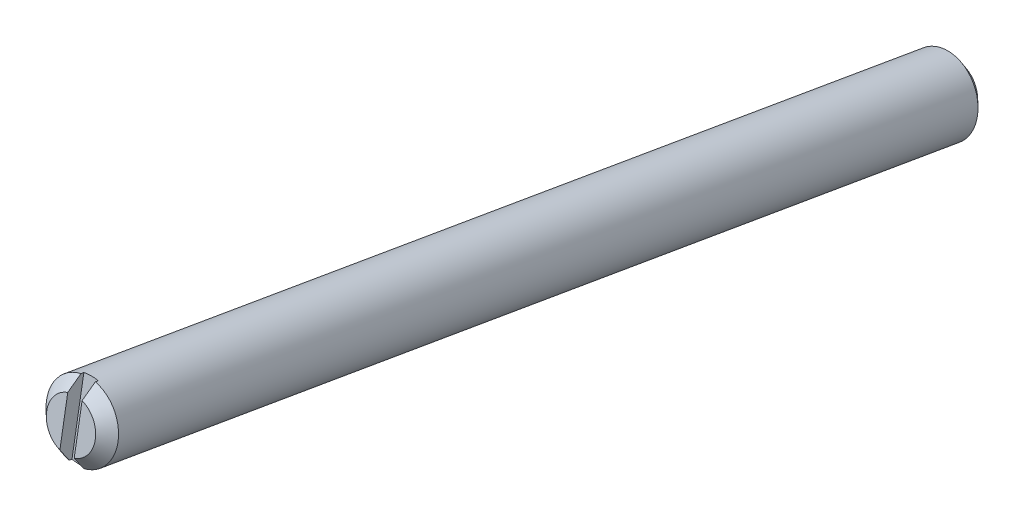
ISO-10303-21;
HEADER;
FILE_DESCRIPTION(('STEP AP214'),'2;1');
FILE_NAME('part.step','',(''),(''),'','','');
FILE_SCHEMA(('AUTOMOTIVE_DESIGN { 1 0 10303 214 1 1 1 1 }'));
ENDSEC;
DATA;
#1=APPLICATION_CONTEXT('core data for automotive mechanical design processes');
#2=APPLICATION_PROTOCOL_DEFINITION('international standard','automotive_design',2000,#1);
#3=PRODUCT_CONTEXT('',#1,'mechanical');
#4=PRODUCT('Part','Part','',(#3));
#5=PRODUCT_RELATED_PRODUCT_CATEGORY('part','',(#4));
#6=PRODUCT_DEFINITION_FORMATION('','',#4);
#7=PRODUCT_DEFINITION_CONTEXT('part definition',#1,'design');
#8=PRODUCT_DEFINITION('design','',#6,#7);
#9=PRODUCT_DEFINITION_SHAPE('','',#8);
#10=(LENGTH_UNIT() NAMED_UNIT(*) SI_UNIT(.MILLI.,.METRE.));
#11=(NAMED_UNIT(*) PLANE_ANGLE_UNIT() SI_UNIT($,.RADIAN.));
#12=(NAMED_UNIT(*) SI_UNIT($,.STERADIAN.) SOLID_ANGLE_UNIT());
#13=UNCERTAINTY_MEASURE_WITH_UNIT(LENGTH_MEASURE(1.E-05),#10,'distance_accuracy_value','');
#14=(GEOMETRIC_REPRESENTATION_CONTEXT(3) GLOBAL_UNCERTAINTY_ASSIGNED_CONTEXT((#13)) GLOBAL_UNIT_ASSIGNED_CONTEXT((#10,
#11,#12)) REPRESENTATION_CONTEXT('',''));
#15=CARTESIAN_POINT('',(0.,0.,0.));
#16=DIRECTION('',(0.,0.,1.));
#17=DIRECTION('',(1.,0.,0.));
#18=AXIS2_PLACEMENT_3D('',#15,#16,#17);
#19=CARTESIAN_POINT('',(18.5,24.9286163690419,-14.3895334289005));
#20=DIRECTION('',(0.,0.168953334472427,0.985624051436778));
#21=DIRECTION('',(-1.,0.,0.));
#22=AXIS2_PLACEMENT_3D('',#19,#20,#21);
#23=CONICAL_SURFACE('',#22,4.2,0.78539816339745);
#24=CARTESIAN_POINT('',(18.5,24.793453701464,-15.17803267005));
#25=DIRECTION('',(0.,0.168953334472427,0.985624051436778));
#26=DIRECTION('',(-1.,0.,0.));
#27=AXIS2_PLACEMENT_3D('',#24,#25,#26);
#28=CIRCLE('',#27,3.4);
#29=CARTESIAN_POINT('',(15.1,24.793453701464,-15.17803267005));
#30=VERTEX_POINT('',#29);
#31=EDGE_CURVE('E11',#30,#30,#28,.T.);
#32=ORIENTED_EDGE('',*,*,#31,.T.);
#33=EDGE_LOOP('',(#32));
#34=FACE_BOUND('',#33,.T.);
#35=CARTESIAN_POINT('',(18.5,25.0637790366199,-13.6010341877511));
#36=DIRECTION('',(0.,0.168953334472427,0.985624051436778));
#37=DIRECTION('',(-1.,0.,0.));
#38=AXIS2_PLACEMENT_3D('',#35,#36,#37);
#39=CIRCLE('',#38,5.);
#40=CARTESIAN_POINT('',(13.5,25.0637790366199,-13.6010341877511));
#41=VERTEX_POINT('',#40);
#42=EDGE_CURVE('E134',#41,#41,#39,.T.);
#43=ORIENTED_EDGE('',*,*,#42,.F.);
#44=EDGE_LOOP('',(#43));
#45=FACE_BOUND('',#44,.T.);
#46=ADVANCED_FACE('F17',(#34,#45),#23,.T.);
#47=CARTESIAN_POINT('',(18.5,45.7774578429394,107.236474518398));
#48=DIRECTION('',(0.,-0.168953334472427,-0.985624051436778));
#49=DIRECTION('',(-0.979795897113271,-0.197124810287356,0.0337906668944858));
#50=AXIS2_PLACEMENT_3D('',#47,#48,#49);
#51=CONICAL_SURFACE('',#50,4.2,0.78539816339745);
#52=CARTESIAN_POINT('',(18.5,45.6422951753614,106.447975277248));
#53=DIRECTION('',(0.,0.168953334472427,0.985624051436778));
#54=DIRECTION('',(-0.2,0.965710401693915,-0.16553978391969));
#55=AXIS2_PLACEMENT_3D('',#52,#53,#54);
#56=CIRCLE('',#55,5.);
#57=CARTESIAN_POINT('',(17.5,50.470847183831,105.62027635765));
#58=VERTEX_POINT('',#57);
#59=CARTESIAN_POINT('',(13.5,45.6422951753614,106.447975277248));
#60=VERTEX_POINT('',#59);
#61=EDGE_CURVE('E153',#58,#60,#56,.T.);
#62=ORIENTED_EDGE('',*,*,#61,.T.);
#63=CARTESIAN_POINT('',(18.5,45.6422951753614,106.447975277248));
#64=DIRECTION('',(0.,0.168953334472427,0.985624051436778));
#65=DIRECTION('',(-1.,0.,0.));
#66=AXIS2_PLACEMENT_3D('',#63,#64,#65);
#67=CIRCLE('',#66,5.);
#68=CARTESIAN_POINT('',(17.5,40.8137431668919,107.275674196847));
#69=VERTEX_POINT('',#68);
#70=EDGE_CURVE('E150',#60,#69,#67,.T.);
#71=ORIENTED_EDGE('',*,*,#70,.T.);
#72=CARTESIAN_POINT('',(17.5,40.8137431668919,107.275674196847));
#73=CARTESIAN_POINT('',(17.5,40.9173075964634,107.347353775387));
#74=CARTESIAN_POINT('',(17.5,41.0277724140901,107.423721007748));
#75=CARTESIAN_POINT('',(17.5,41.2355486457281,107.567148543276));
#76=CARTESIAN_POINT('',(17.5,41.4429496571701,107.710115308227));
#77=CARTESIAN_POINT('',(17.5,41.6451001573134,107.849017023928));
#78=CARTESIAN_POINT('',(17.5,41.8556720049782,107.993413851894));
#79=CARTESIAN_POINT('',(17.5,42.0261269469763,108.11005994117));
#80=CARTESIAN_POINT('',(17.5,42.2385203226982,108.254825106778));
#81=CARTESIAN_POINT('',(17.5,42.4171900261511,108.3762551526));
#82=CARTESIAN_POINT('',(17.5,42.5675274270475,108.478082747319));
#83=CARTESIAN_POINT('',(17.5,42.6747684807775,108.550450791225));
#84=CARTESIAN_POINT('',(17.5,42.7097214519552,108.574007110685));
#85=(BOUNDED_CURVE() B_SPLINE_CURVE(3,(#72,#73,#74,#75,#76,#77,#78,#79,#80,#81,#82,#83,#84),
.UNSPECIFIED.,.F.,.F.) B_SPLINE_CURVE_WITH_KNOTS((4,1,1,1,1,1,1,1,1,1,4),(0.,0.164432285209661,
0.175322036538691,0.329608986927773,0.493296007394346,0.495530634029008,0.662942303700203,
0.762946894621977,0.831098980296955,0.944972635631533,1.),
.UNSPECIFIED.) CURVE() GEOMETRIC_REPRESENTATION_ITEM() RATIONAL_B_SPLINE_CURVE((1.,1.,1.,1.,1.,
1.,1.,1.,1.,1.,1.,1.,1.)) REPRESENTATION_ITEM(''));
#86=CARTESIAN_POINT('',(17.5,42.7097214519552,108.574007110685));
#87=VERTEX_POINT('',#86);
#88=EDGE_CURVE('E26',#69,#87,#85,.T.);
#89=ORIENTED_EDGE('',*,*,#88,.T.);
#90=CARTESIAN_POINT('',(18.5,45.9126205105173,108.024973759547));
#91=DIRECTION('',(0.,0.168953334472426,0.985624051436778));
#92=DIRECTION('',(-0.294117646904669,0.942029134917965,-0.161480397401579));
#93=AXIS2_PLACEMENT_3D('',#90,#91,#92);
#94=CIRCLE('',#93,3.4);
#95=CARTESIAN_POINT('',(17.5000000001743,49.1155195700125,107.475940407934));
#96=VERTEX_POINT('',#95);
#97=EDGE_CURVE('E185',#96,#87,#94,.T.);
#98=ORIENTED_EDGE('',*,*,#97,.F.);
#99=CARTESIAN_POINT('',(17.4999999999988,49.1155195698818,107.475940407327));
#100=CARTESIAN_POINT('',(17.4999999999994,49.1406316525485,107.442087879121));
#101=CARTESIAN_POINT('',(17.5000000000006,49.2176481649491,107.338134840865));
#102=CARTESIAN_POINT('',(17.5,49.3254891619477,107.192050918553));
#103=CARTESIAN_POINT('',(17.5,49.4535163820363,107.018047614404));
#104=CARTESIAN_POINT('',(17.5,49.605570237469,106.810809769992));
#105=CARTESIAN_POINT('',(17.5,49.7274449722873,106.644053221671));
#106=CARTESIAN_POINT('',(17.5,49.8779039660401,106.437769344263));
#107=CARTESIAN_POINT('',(17.5,50.0222525322234,106.23947158145));
#108=CARTESIAN_POINT('',(17.5,50.1701979953074,106.035592167627));
#109=CARTESIAN_POINT('',(17.5,50.3183437979276,105.831153322163));
#110=CARTESIAN_POINT('',(17.5,50.39706810268,105.722355739686));
#111=CARTESIAN_POINT('',(17.5,50.470847183831,105.62027635765));
#112=(BOUNDED_CURVE() B_SPLINE_CURVE(3,(#99,#100,#101,#102,#103,#104,#105,#106,#107,#108,#109,
#110,#111),.UNSPECIFIED.,.F.,.F.) B_SPLINE_CURVE_WITH_KNOTS((4,1,1,1,1,1,1,1,1,1,4),(-1.,
-0.944972635892414,-0.831098980393359,-0.762946895069346,-0.662942303860907,-0.495530634221856,
-0.493296007683616,-0.329608987088477,-0.175322036641499,-0.16443228530608,0.),
.UNSPECIFIED.) CURVE() GEOMETRIC_REPRESENTATION_ITEM() RATIONAL_B_SPLINE_CURVE((1.,1.,1.,1.,1.,
1.,1.,1.,1.,1.,1.,1.,1.)) REPRESENTATION_ITEM(''));
#113=EDGE_CURVE('E117',#96,#58,#112,.T.);
#114=ORIENTED_EDGE('',*,*,#113,.T.);
#115=EDGE_LOOP('',(#62,#71,#89,#98,#114));
#116=FACE_BOUND('',#115,.T.);
#117=ADVANCED_FACE('F19',(#116),#51,.T.);
#118=CARTESIAN_POINT('',(18.5,45.7774578429394,107.236474518398));
#119=DIRECTION('',(0.,-0.168953334472427,-0.985624051436778));
#120=DIRECTION('',(0.979795897113271,0.197124810287356,-0.0337906668944858));
#121=AXIS2_PLACEMENT_3D('',#118,#119,#120);
#122=CONICAL_SURFACE('',#121,4.2,0.78539816339745);
#123=CARTESIAN_POINT('',(18.5,45.6422951753614,106.447975277248));
#124=DIRECTION('',(0.,0.168953334472427,0.985624051436778));
#125=DIRECTION('',(0.2,-0.965710401693915,0.16553978391969));
#126=AXIS2_PLACEMENT_3D('',#123,#124,#125);
#127=CIRCLE('',#126,5.);
#128=CARTESIAN_POINT('',(19.5,40.8137431668919,107.275674196847));
#129=VERTEX_POINT('',#128);
#130=CARTESIAN_POINT('',(19.5,50.470847183831,105.62027635765));
#131=VERTEX_POINT('',#130);
#132=EDGE_CURVE('E125',#129,#131,#127,.T.);
#133=ORIENTED_EDGE('',*,*,#132,.T.);
#134=CARTESIAN_POINT('',(19.5,50.470847183831,105.62027635765));
#135=CARTESIAN_POINT('',(19.5,50.3970681026799,105.722355739685));
#136=CARTESIAN_POINT('',(19.5,50.3183437979275,105.831153322163));
#137=CARTESIAN_POINT('',(19.5,50.1701979952928,106.035592167647));
#138=CARTESIAN_POINT('',(19.5,50.0222525322083,106.23947158147));
#139=CARTESIAN_POINT('',(19.5,49.8779039659818,106.437769344344));
#140=CARTESIAN_POINT('',(19.5,49.7274449721397,106.644053221872));
#141=CARTESIAN_POINT('',(19.5,49.6055702373217,106.810809770193));
#142=CARTESIAN_POINT('',(19.5,49.4535163817556,107.018047614786));
#143=CARTESIAN_POINT('',(19.5,49.325489161637,107.192050918975));
#144=CARTESIAN_POINT('',(19.5,49.2176481643705,107.338134841647));
#145=CARTESIAN_POINT('',(19.5,49.1406316518802,107.442087880024));
#146=CARTESIAN_POINT('',(19.5,49.1155195690794,107.475940408409));
#147=(BOUNDED_CURVE() B_SPLINE_CURVE(3,(#134,#135,#136,#137,#138,#139,#140,#141,#142,#143,#144,
#145,#146),.UNSPECIFIED.,.F.,.F.) B_SPLINE_CURVE_WITH_KNOTS((4,1,1,1,1,1,1,1,1,1,4),(0.,
0.164432285209656,0.175322036538704,0.329608986927784,0.49329600739437,0.495530634029014,
0.662942303700213,0.762946894622001,0.831098980296964,0.944972635631551,1.),
.UNSPECIFIED.) CURVE() GEOMETRIC_REPRESENTATION_ITEM() RATIONAL_B_SPLINE_CURVE((1.,1.,1.,1.,1.,
1.,1.,1.,1.,1.,1.,1.,1.)) REPRESENTATION_ITEM(''));
#148=CARTESIAN_POINT('',(19.5,49.1155195690794,107.475940408409));
#149=VERTEX_POINT('',#148);
#150=EDGE_CURVE('E105',#131,#149,#147,.T.);
#151=ORIENTED_EDGE('',*,*,#150,.T.);
#152=CARTESIAN_POINT('',(18.5,45.9126205105173,108.024973759547));
#153=DIRECTION('',(0.,0.168953334472426,0.985624051436778));
#154=DIRECTION('',(0.29411764690467,-0.942029134917964,0.161480397401579));
#155=AXIS2_PLACEMENT_3D('',#152,#153,#154);
#156=CIRCLE('',#155,3.4);
#157=CARTESIAN_POINT('',(19.4999999998257,42.7097214509173,108.574007110548));
#158=VERTEX_POINT('',#157);
#159=EDGE_CURVE('E193',#158,#149,#156,.T.);
#160=ORIENTED_EDGE('',*,*,#159,.F.);
#161=CARTESIAN_POINT('',(19.5000000000012,42.7097214508381,108.574007109932));
#162=CARTESIAN_POINT('',(19.5000000000006,42.6747684798468,108.550450790597));
#163=CARTESIAN_POINT('',(19.4999999999994,42.5675274262413,108.478082746773));
#164=CARTESIAN_POINT('',(19.5,42.4171900257175,108.376255152305));
#165=CARTESIAN_POINT('',(19.5,42.2385203223063,108.254825106512));
#166=CARTESIAN_POINT('',(19.5,42.0261269467702,108.11005994103));
#167=CARTESIAN_POINT('',(19.5,41.8556720047724,107.993413851753));
#168=CARTESIAN_POINT('',(19.5,41.645100157231,107.849017023871));
#169=CARTESIAN_POINT('',(19.5,41.4429496571496,107.710115308213));
#170=CARTESIAN_POINT('',(19.5,41.2355486457076,107.567148543262));
#171=CARTESIAN_POINT('',(19.5,41.0277724140901,107.423721007748));
#172=CARTESIAN_POINT('',(19.5,40.9173075964634,107.347353775387));
#173=CARTESIAN_POINT('',(19.5,40.8137431668919,107.275674196847));
#174=(BOUNDED_CURVE() B_SPLINE_CURVE(3,(#161,#162,#163,#164,#165,#166,#167,#168,#169,#170,#171,
#172,#173),.UNSPECIFIED.,.F.,.F.) B_SPLINE_CURVE_WITH_KNOTS((4,1,1,1,1,1,1,1,1,1,4),(-1.,
-0.944972635892433,-0.83109898039337,-0.762946895069338,-0.662942303860907,-0.495530634221852,
-0.493296007683616,-0.329608987088481,-0.175322036641492,-0.164432285306081,0.),
.UNSPECIFIED.) CURVE() GEOMETRIC_REPRESENTATION_ITEM() RATIONAL_B_SPLINE_CURVE((1.,1.,1.,1.,1.,
1.,1.,1.,1.,1.,1.,1.,1.)) REPRESENTATION_ITEM(''));
#175=EDGE_CURVE('E118',#158,#129,#174,.T.);
#176=ORIENTED_EDGE('',*,*,#175,.T.);
#177=EDGE_LOOP('',(#133,#151,#160,#176));
#178=FACE_BOUND('',#177,.T.);
#179=ADVANCED_FACE('F130',(#178),#122,.T.);
#180=CARTESIAN_POINT('',(18.5,24.793453701464,-15.17803267005));
#181=DIRECTION('',(0.,0.168953334472427,0.985624051436778));
#182=DIRECTION('',(1.,0.,0.));
#183=AXIS2_PLACEMENT_3D('',#180,#181,#182);
#184=PLANE('',#183);
#185=ORIENTED_EDGE('',*,*,#31,.F.);
#186=EDGE_LOOP('',(#185));
#187=FACE_BOUND('',#186,.T.);
#188=ADVANCED_FACE('F237',(#187),#184,.F.);
#189=CARTESIAN_POINT('',(17.5,51.2836968340405,105.075105348436));
#190=DIRECTION('',(-1.,0.,0.));
#191=DIRECTION('',(0.,1.,0.));
#192=AXIS2_PLACEMENT_3D('',#189,#190,#191);
#193=PLANE('',#192);
#194=ORIENTED_EDGE('',*,*,#113,.F.);
#195=DIRECTION('',(0.,0.985624051436778,-0.168953334472425));
#196=VECTOR('',#195,1.);
#197=CARTESIAN_POINT('',(17.5,49.1155195709172,107.475940408094));
#198=LINE('',#197,#196);
#199=EDGE_CURVE('E188',#87,#96,#198,.T.);
#200=ORIENTED_EDGE('',*,*,#199,.F.);
#201=ORIENTED_EDGE('',*,*,#88,.F.);
#202=DIRECTION('',(0.,0.168953334472419,0.985624051436779));
#203=VECTOR('',#202,1.);
#204=CARTESIAN_POINT('',(17.5,40.7461618331029,106.881424576272));
#205=LINE('',#204,#203);
#206=CARTESIAN_POINT('',(17.5,40.7461618331029,106.881424576272));
#207=VERTEX_POINT('',#206);
#208=EDGE_CURVE('E146',#207,#69,#205,.T.);
#209=ORIENTED_EDGE('',*,*,#208,.F.);
#210=DIRECTION('',(0.,-0.985624051436778,0.168953334472426));
#211=VECTOR('',#210,1.);
#212=CARTESIAN_POINT('',(17.5,50.403265850042,105.226026737075));
#213=LINE('',#212,#211);
#214=CARTESIAN_POINT('',(17.5,50.403265850042,105.226026737075));
#215=VERTEX_POINT('',#214);
#216=EDGE_CURVE('E73',#215,#207,#213,.T.);
#217=ORIENTED_EDGE('',*,*,#216,.F.);
#218=DIRECTION('',(0.,-0.168953334472424,-0.985624051436778));
#219=VECTOR('',#218,1.);
#220=CARTESIAN_POINT('',(17.5,50.403265850042,105.226026737075));
#221=LINE('',#220,#219);
#222=EDGE_CURVE('E155',#58,#215,#221,.T.);
#223=ORIENTED_EDGE('',*,*,#222,.F.);
#224=EDGE_LOOP('',(#194,#200,#201,#209,#217,#223));
#225=FACE_BOUND('',#224,.T.);
#226=ADVANCED_FACE('F189',(#225),#193,.F.);
#227=CARTESIAN_POINT('',(19.5,40.0340940695466,107.003485541452));
#228=DIRECTION('',(1.,0.,0.));
#229=DIRECTION('',(0.,0.,-1.));
#230=AXIS2_PLACEMENT_3D('',#227,#228,#229);
#231=PLANE('',#230);
#232=ORIENTED_EDGE('',*,*,#175,.F.);
#233=DIRECTION('',(0.,-0.985624051436778,0.168953334472425));
#234=VECTOR('',#233,1.);
#235=CARTESIAN_POINT('',(19.5,42.7097214501174,108.574007111));
#236=LINE('',#235,#234);
#237=EDGE_CURVE('E111',#149,#158,#236,.T.);
#238=ORIENTED_EDGE('',*,*,#237,.F.);
#239=ORIENTED_EDGE('',*,*,#150,.F.);
#240=DIRECTION('',(0.,0.168953334472413,0.98562405143678));
#241=VECTOR('',#240,1.);
#242=CARTESIAN_POINT('',(19.5,50.403265850042,105.226026737075));
#243=LINE('',#242,#241);
#244=CARTESIAN_POINT('',(19.5,50.403265850042,105.226026737075));
#245=VERTEX_POINT('',#244);
#246=EDGE_CURVE('E108',#245,#131,#243,.T.);
#247=ORIENTED_EDGE('',*,*,#246,.F.);
#248=DIRECTION('',(0.,0.985624051436778,-0.168953334472426));
#249=VECTOR('',#248,1.);
#250=CARTESIAN_POINT('',(19.5,40.7461618331029,106.881424576272));
#251=LINE('',#250,#249);
#252=CARTESIAN_POINT('',(19.5,40.7461618331029,106.881424576272));
#253=VERTEX_POINT('',#252);
#254=EDGE_CURVE('E46',#253,#245,#251,.T.);
#255=ORIENTED_EDGE('',*,*,#254,.F.);
#256=DIRECTION('',(0.,-0.168953334472407,-0.985624051436781));
#257=VECTOR('',#256,1.);
#258=CARTESIAN_POINT('',(19.5,40.7461618331029,106.881424576272));
#259=LINE('',#258,#257);
#260=EDGE_CURVE('E133',#129,#253,#259,.T.);
#261=ORIENTED_EDGE('',*,*,#260,.F.);
#262=EDGE_LOOP('',(#232,#238,#239,#247,#255,#261));
#263=FACE_BOUND('',#262,.T.);
#264=ADVANCED_FACE('F107',(#263),#231,.F.);
#265=CARTESIAN_POINT('',(18.5,45.5747138415725,106.053725656674));
#266=DIRECTION('',(0.,0.168953334472427,0.985624051436778));
#267=DIRECTION('',(1.,0.,0.));
#268=AXIS2_PLACEMENT_3D('',#265,#266,#267);
#269=PLANE('',#268);
#270=CARTESIAN_POINT('',(18.5,45.5747138415725,106.053725656674));
#271=DIRECTION('',(0.,-0.168953334472426,-0.985624051436778));
#272=DIRECTION('',(-0.2,-0.965710401693915,0.16553978391969));
#273=AXIS2_PLACEMENT_3D('',#270,#271,#272);
#274=CIRCLE('',#273,5.);
#275=EDGE_CURVE('E139',#253,#207,#274,.T.);
#276=ORIENTED_EDGE('',*,*,#275,.F.);
#277=ORIENTED_EDGE('',*,*,#254,.T.);
#278=CARTESIAN_POINT('',(18.5,45.5747138415725,106.053725656674));
#279=DIRECTION('',(0.,-0.168953334472426,-0.985624051436778));
#280=DIRECTION('',(0.2,0.965710401693915,-0.16553978391969));
#281=AXIS2_PLACEMENT_3D('',#278,#279,#280);
#282=CIRCLE('',#281,5.);
#283=EDGE_CURVE('E127',#215,#245,#282,.T.);
#284=ORIENTED_EDGE('',*,*,#283,.F.);
#285=ORIENTED_EDGE('',*,*,#216,.T.);
#286=EDGE_LOOP('',(#276,#277,#284,#285));
#287=FACE_BOUND('',#286,.T.);
#288=ADVANCED_FACE('F213',(#287),#269,.T.);
#289=CARTESIAN_POINT('',(18.5,24.793453701464,-15.17803267005));
#290=DIRECTION('',(0.,0.168953334472427,0.985624051436778));
#291=DIRECTION('',(-1.,0.,0.));
#292=AXIS2_PLACEMENT_3D('',#289,#290,#291);
#293=CYLINDRICAL_SURFACE('',#292,5.);
#294=ORIENTED_EDGE('',*,*,#132,.F.);
#295=ORIENTED_EDGE('',*,*,#260,.T.);
#296=ORIENTED_EDGE('',*,*,#275,.T.);
#297=ORIENTED_EDGE('',*,*,#208,.T.);
#298=ORIENTED_EDGE('',*,*,#70,.F.);
#299=ORIENTED_EDGE('',*,*,#61,.F.);
#300=ORIENTED_EDGE('',*,*,#222,.T.);
#301=ORIENTED_EDGE('',*,*,#283,.T.);
#302=ORIENTED_EDGE('',*,*,#246,.T.);
#303=EDGE_LOOP('',(#294,#295,#296,#297,#298,#299,#300,#301,#302));
#304=FACE_BOUND('',#303,.T.);
#305=ORIENTED_EDGE('',*,*,#42,.T.);
#306=EDGE_LOOP('',(#305));
#307=FACE_BOUND('',#306,.T.);
#308=ADVANCED_FACE('F122',(#304,#307),#293,.T.);
#309=CARTESIAN_POINT('',(18.5,45.9126205105173,108.024973759547));
#310=DIRECTION('',(0.,0.168953334472427,0.985624051436778));
#311=DIRECTION('',(1.,0.,0.));
#312=AXIS2_PLACEMENT_3D('',#309,#310,#311);
#313=PLANE('',#312);
#314=ORIENTED_EDGE('',*,*,#159,.T.);
#315=ORIENTED_EDGE('',*,*,#237,.T.);
#316=EDGE_LOOP('',(#314,#315));
#317=FACE_BOUND('',#316,.T.);
#318=ADVANCED_FACE('F222',(#317),#313,.T.);
#319=CARTESIAN_POINT('',(18.5,45.9126205105173,108.024973759547));
#320=DIRECTION('',(0.,0.168953334472427,0.985624051436778));
#321=DIRECTION('',(1.,0.,0.));
#322=AXIS2_PLACEMENT_3D('',#319,#320,#321);
#323=PLANE('',#322);
#324=ORIENTED_EDGE('',*,*,#97,.T.);
#325=ORIENTED_EDGE('',*,*,#199,.T.);
#326=EDGE_LOOP('',(#324,#325));
#327=FACE_BOUND('',#326,.T.);
#328=ADVANCED_FACE('F195',(#327),#323,.T.);
#329=CLOSED_SHELL('',(#46,#117,#179,#188,#226,#264,#288,#308,#318,#328));
#330=MANIFOLD_SOLID_BREP('B1',#329);
#331=ADVANCED_BREP_SHAPE_REPRESENTATION('',(#18,#330),#14);
#332=SHAPE_DEFINITION_REPRESENTATION(#9,#331);
ENDSEC;
END-ISO-10303-21;
